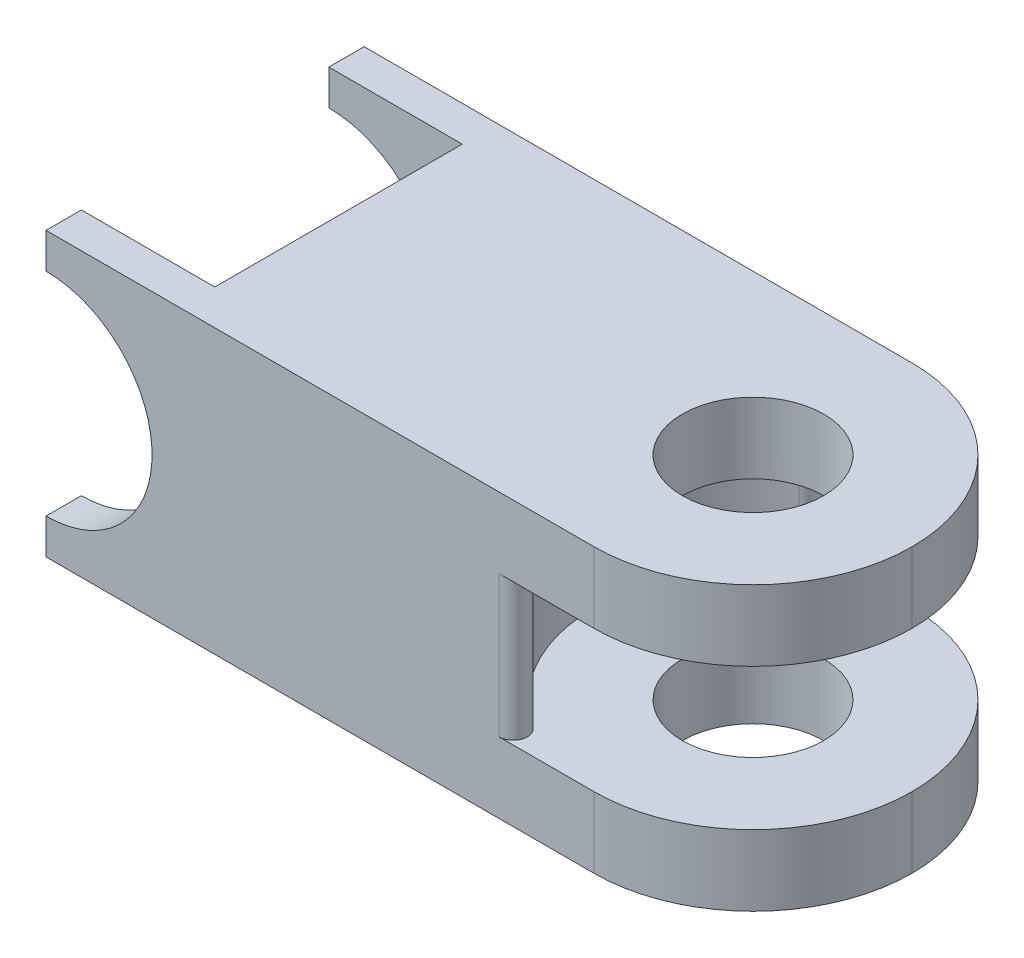
ISO-10303-21;
HEADER;
FILE_DESCRIPTION(('STEP AP214'),'2;1');
FILE_NAME('part.step','',(''),(''),'','','');
FILE_SCHEMA(('AUTOMOTIVE_DESIGN { 1 0 10303 214 1 1 1 1 }'));
ENDSEC;
DATA;
#1=APPLICATION_CONTEXT('core data for automotive mechanical design processes');
#2=APPLICATION_PROTOCOL_DEFINITION('international standard','automotive_design',2000,#1);
#3=PRODUCT_CONTEXT('',#1,'mechanical');
#4=PRODUCT('Part','Part','',(#3));
#5=PRODUCT_RELATED_PRODUCT_CATEGORY('part','',(#4));
#6=PRODUCT_DEFINITION_FORMATION('','',#4);
#7=PRODUCT_DEFINITION_CONTEXT('part definition',#1,'design');
#8=PRODUCT_DEFINITION('design','',#6,#7);
#9=PRODUCT_DEFINITION_SHAPE('','',#8);
#10=(LENGTH_UNIT() NAMED_UNIT(*) SI_UNIT(.MILLI.,.METRE.));
#11=(NAMED_UNIT(*) PLANE_ANGLE_UNIT() SI_UNIT($,.RADIAN.));
#12=(NAMED_UNIT(*) SI_UNIT($,.STERADIAN.) SOLID_ANGLE_UNIT());
#13=UNCERTAINTY_MEASURE_WITH_UNIT(LENGTH_MEASURE(1.E-05),#10,'distance_accuracy_value','');
#14=(GEOMETRIC_REPRESENTATION_CONTEXT(3) GLOBAL_UNCERTAINTY_ASSIGNED_CONTEXT((#13)) GLOBAL_UNIT_ASSIGNED_CONTEXT((#10,
#11,#12)) REPRESENTATION_CONTEXT('',''));
#15=CARTESIAN_POINT('',(0.,0.,0.));
#16=DIRECTION('',(0.,0.,1.));
#17=DIRECTION('',(1.,0.,0.));
#18=AXIS2_PLACEMENT_3D('',#15,#16,#17);
#19=CARTESIAN_POINT('',(27.5,-20.,0.));
#20=DIRECTION('',(0.,-1.,0.));
#21=DIRECTION('',(0.,0.,-1.));
#22=AXIS2_PLACEMENT_3D('',#19,#20,#21);
#23=CYLINDRICAL_SURFACE('',#22,22.5);
#24=DIRECTION('',(0.,1.,0.));
#25=VECTOR('',#24,1.);
#26=CARTESIAN_POINT('',(27.5,-20.,-22.5));
#27=LINE('',#26,#25);
#28=CARTESIAN_POINT('',(27.5,-10.,-22.5));
#29=VERTEX_POINT('',#28);
#30=CARTESIAN_POINT('',(27.5,-20.,-22.5));
#31=VERTEX_POINT('',#30);
#32=EDGE_CURVE('E220',#29,#31,#27,.F.);
#33=ORIENTED_EDGE('',*,*,#32,.F.);
#34=CARTESIAN_POINT('',(27.5,-10.,0.));
#35=DIRECTION('',(0.,1.,0.));
#36=DIRECTION('',(0.,0.,1.));
#37=AXIS2_PLACEMENT_3D('',#34,#35,#36);
#38=CIRCLE('',#37,22.5);
#39=CARTESIAN_POINT('',(50.,-10.,0.));
#40=VERTEX_POINT('',#39);
#41=EDGE_CURVE('E257',#40,#29,#38,.T.);
#42=ORIENTED_EDGE('',*,*,#41,.F.);
#43=DIRECTION('',(0.,1.,0.));
#44=VECTOR('',#43,1.);
#45=CARTESIAN_POINT('',(50.,20.,0.));
#46=LINE('',#45,#44);
#47=CARTESIAN_POINT('',(50.,-20.,0.));
#48=VERTEX_POINT('',#47);
#49=EDGE_CURVE('E223',#48,#40,#46,.T.);
#50=ORIENTED_EDGE('',*,*,#49,.F.);
#51=CARTESIAN_POINT('',(27.5,-20.,0.));
#52=DIRECTION('',(0.,1.,0.));
#53=DIRECTION('',(0.,0.,1.));
#54=AXIS2_PLACEMENT_3D('',#51,#52,#53);
#55=CIRCLE('',#54,22.5);
#56=EDGE_CURVE('E216',#31,#48,#55,.F.);
#57=ORIENTED_EDGE('',*,*,#56,.F.);
#58=EDGE_LOOP('',(#33,#42,#50,#57));
#59=FACE_BOUND('',#58,.T.);
#60=ADVANCED_FACE('F43',(#59),#23,.T.);
#61=CARTESIAN_POINT('',(27.5,0.,0.));
#62=DIRECTION('',(0.,1.,0.));
#63=DIRECTION('',(0.,0.,1.));
#64=AXIS2_PLACEMENT_3D('',#61,#62,#63);
#65=CYLINDRICAL_SURFACE('',#64,22.5);
#66=ORIENTED_EDGE('',*,*,#49,.T.);
#67=CARTESIAN_POINT('',(27.5,-10.,22.5));
#68=VERTEX_POINT('',#67);
#69=EDGE_CURVE('E259',#68,#40,#38,.T.);
#70=ORIENTED_EDGE('',*,*,#69,.F.);
#71=DIRECTION('',(0.,1.,0.));
#72=VECTOR('',#71,1.);
#73=CARTESIAN_POINT('',(27.5,0.,22.5));
#74=LINE('',#73,#72);
#75=CARTESIAN_POINT('',(27.5,-20.,22.5));
#76=VERTEX_POINT('',#75);
#77=EDGE_CURVE('E205',#76,#68,#74,.T.);
#78=ORIENTED_EDGE('',*,*,#77,.F.);
#79=CARTESIAN_POINT('',(27.5,-20.,0.));
#80=DIRECTION('',(0.,1.,0.));
#81=DIRECTION('',(0.,0.,1.));
#82=AXIS2_PLACEMENT_3D('',#79,#80,#81);
#83=CIRCLE('',#82,22.5);
#84=EDGE_CURVE('E218',#48,#76,#83,.F.);
#85=ORIENTED_EDGE('',*,*,#84,.F.);
#86=EDGE_LOOP('',(#66,#70,#78,#85));
#87=FACE_BOUND('',#86,.T.);
#88=ADVANCED_FACE('F388',(#87),#65,.T.);
#89=CARTESIAN_POINT('',(-50.,-20.,22.5));
#90=DIRECTION('',(-1.,0.,0.));
#91=DIRECTION('',(0.,0.,1.));
#92=AXIS2_PLACEMENT_3D('',#89,#90,#91);
#93=PLANE('',#92);
#94=DIRECTION('',(0.,0.,1.));
#95=VECTOR('',#94,1.);
#96=CARTESIAN_POINT('',(-50.,-15.,-50.));
#97=LINE('',#96,#95);
#98=CARTESIAN_POINT('',(-50.,-15.,-22.5));
#99=VERTEX_POINT('',#98);
#100=CARTESIAN_POINT('',(-50.,-15.,-17.5));
#101=VERTEX_POINT('',#100);
#102=EDGE_CURVE('E283',#99,#101,#97,.T.);
#103=ORIENTED_EDGE('',*,*,#102,.F.);
#104=DIRECTION('',(0.,1.,0.));
#105=VECTOR('',#104,1.);
#106=CARTESIAN_POINT('',(-50.,-20.,-22.5));
#107=LINE('',#106,#105);
#108=CARTESIAN_POINT('',(-50.,-20.,-22.5));
#109=VERTEX_POINT('',#108);
#110=EDGE_CURVE('E320',#109,#99,#107,.T.);
#111=ORIENTED_EDGE('',*,*,#110,.F.);
#112=DIRECTION('',(0.,0.,-1.));
#113=VECTOR('',#112,1.);
#114=CARTESIAN_POINT('',(-50.,-20.,22.5));
#115=LINE('',#114,#113);
#116=CARTESIAN_POINT('',(-50.,-20.,-17.5));
#117=VERTEX_POINT('',#116);
#118=EDGE_CURVE('E331',#117,#109,#115,.T.);
#119=ORIENTED_EDGE('',*,*,#118,.F.);
#120=DIRECTION('',(0.,1.,0.));
#121=VECTOR('',#120,1.);
#122=CARTESIAN_POINT('',(-50.,-20.,-17.5));
#123=LINE('',#122,#121);
#124=EDGE_CURVE('E301',#117,#101,#123,.T.);
#125=ORIENTED_EDGE('',*,*,#124,.T.);
#126=EDGE_LOOP('',(#103,#111,#119,#125));
#127=FACE_BOUND('',#126,.T.);
#128=ADVANCED_FACE('F375',(#127),#93,.T.);
#129=DIRECTION('',(0.,0.,1.));
#130=VECTOR('',#129,1.);
#131=CARTESIAN_POINT('',(-50.,-15.,-50.));
#132=LINE('',#131,#130);
#133=CARTESIAN_POINT('',(-50.,-15.,17.5));
#134=VERTEX_POINT('',#133);
#135=CARTESIAN_POINT('',(-50.,-15.,22.5));
#136=VERTEX_POINT('',#135);
#137=EDGE_CURVE('E274',#134,#136,#132,.T.);
#138=ORIENTED_EDGE('',*,*,#137,.F.);
#139=DIRECTION('',(0.,1.,0.));
#140=VECTOR('',#139,1.);
#141=CARTESIAN_POINT('',(-50.,-20.,17.5));
#142=LINE('',#141,#140);
#143=CARTESIAN_POINT('',(-50.,-20.,17.5));
#144=VERTEX_POINT('',#143);
#145=EDGE_CURVE('E294',#144,#134,#142,.T.);
#146=ORIENTED_EDGE('',*,*,#145,.F.);
#147=CARTESIAN_POINT('',(-50.,-20.,22.5));
#148=VERTEX_POINT('',#147);
#149=EDGE_CURVE('E327',#148,#144,#115,.T.);
#150=ORIENTED_EDGE('',*,*,#149,.F.);
#151=DIRECTION('',(0.,1.,0.));
#152=VECTOR('',#151,1.);
#153=CARTESIAN_POINT('',(-50.,-20.,22.5));
#154=LINE('',#153,#152);
#155=EDGE_CURVE('E310',#148,#136,#154,.T.);
#156=ORIENTED_EDGE('',*,*,#155,.T.);
#157=EDGE_LOOP('',(#138,#146,#150,#156));
#158=FACE_BOUND('',#157,.T.);
#159=ADVANCED_FACE('F363',(#158),#93,.T.);
#160=DIRECTION('',(0.,0.,1.));
#161=VECTOR('',#160,1.);
#162=CARTESIAN_POINT('',(-50.,15.,-50.));
#163=LINE('',#162,#161);
#164=CARTESIAN_POINT('',(-50.,15.,-17.5));
#165=VERTEX_POINT('',#164);
#166=CARTESIAN_POINT('',(-50.,15.,-22.5));
#167=VERTEX_POINT('',#166);
#168=EDGE_CURVE('E281',#165,#167,#163,.F.);
#169=ORIENTED_EDGE('',*,*,#168,.F.);
#170=CARTESIAN_POINT('',(-50.,20.,-17.5));
#171=VERTEX_POINT('',#170);
#172=EDGE_CURVE('E300',#165,#171,#123,.T.);
#173=ORIENTED_EDGE('',*,*,#172,.T.);
#174=DIRECTION('',(0.,0.,-1.));
#175=VECTOR('',#174,1.);
#176=CARTESIAN_POINT('',(-50.,20.,22.5));
#177=LINE('',#176,#175);
#178=CARTESIAN_POINT('',(-50.,20.,-22.5));
#179=VERTEX_POINT('',#178);
#180=EDGE_CURVE('E319',#171,#179,#177,.T.);
#181=ORIENTED_EDGE('',*,*,#180,.T.);
#182=EDGE_CURVE('E309',#167,#179,#107,.T.);
#183=ORIENTED_EDGE('',*,*,#182,.F.);
#184=EDGE_LOOP('',(#169,#173,#181,#183));
#185=FACE_BOUND('',#184,.T.);
#186=ADVANCED_FACE('F376',(#185),#93,.T.);
#187=CARTESIAN_POINT('',(-50.,-20.,22.5));
#188=DIRECTION('',(0.,1.,0.));
#189=DIRECTION('',(0.,0.,1.));
#190=AXIS2_PLACEMENT_3D('',#187,#188,#189);
#191=PLANE('',#190);
#192=CARTESIAN_POINT('',(27.5,-20.,0.));
#193=DIRECTION('',(0.,1.,0.));
#194=DIRECTION('',(0.,0.,1.));
#195=AXIS2_PLACEMENT_3D('',#192,#193,#194);
#196=CIRCLE('',#195,10.);
#197=CARTESIAN_POINT('',(27.5,-20.,10.));
#198=VERTEX_POINT('',#197);
#199=EDGE_CURVE('E429',#198,#198,#196,.T.);
#200=ORIENTED_EDGE('',*,*,#199,.T.);
#201=EDGE_LOOP('',(#200));
#202=FACE_BOUND('',#201,.T.);
#203=ORIENTED_EDGE('',*,*,#56,.T.);
#204=ORIENTED_EDGE('',*,*,#84,.T.);
#205=DIRECTION('',(1.,0.,0.));
#206=VECTOR('',#205,1.);
#207=CARTESIAN_POINT('',(-50.,-20.,22.5));
#208=LINE('',#207,#206);
#209=EDGE_CURVE('E316',#148,#76,#208,.T.);
#210=ORIENTED_EDGE('',*,*,#209,.F.);
#211=ORIENTED_EDGE('',*,*,#149,.T.);
#212=DIRECTION('',(1.,0.,0.));
#213=VECTOR('',#212,1.);
#214=CARTESIAN_POINT('',(-50.,-20.,17.5));
#215=LINE('',#214,#213);
#216=CARTESIAN_POINT('',(-31.1254139118231,-20.,17.5));
#217=VERTEX_POINT('',#216);
#218=EDGE_CURVE('E297',#144,#217,#215,.T.);
#219=ORIENTED_EDGE('',*,*,#218,.T.);
#220=DIRECTION('',(0.,0.,1.));
#221=VECTOR('',#220,1.);
#222=CARTESIAN_POINT('',(-31.1254139118231,-20.,-17.5));
#223=LINE('',#222,#221);
#224=CARTESIAN_POINT('',(-31.1254139118231,-20.,-17.5));
#225=VERTEX_POINT('',#224);
#226=EDGE_CURVE('E306',#217,#225,#223,.F.);
#227=ORIENTED_EDGE('',*,*,#226,.T.);
#228=DIRECTION('',(1.,0.,0.));
#229=VECTOR('',#228,1.);
#230=CARTESIAN_POINT('',(-50.,-20.,-17.5));
#231=LINE('',#230,#229);
#232=EDGE_CURVE('E304',#117,#225,#231,.T.);
#233=ORIENTED_EDGE('',*,*,#232,.F.);
#234=ORIENTED_EDGE('',*,*,#118,.T.);
#235=DIRECTION('',(1.,0.,0.));
#236=VECTOR('',#235,1.);
#237=CARTESIAN_POINT('',(-50.,-20.,-22.5));
#238=LINE('',#237,#236);
#239=EDGE_CURVE('E324',#109,#31,#238,.T.);
#240=ORIENTED_EDGE('',*,*,#239,.T.);
#241=EDGE_LOOP('',(#203,#204,#210,#211,#219,#227,#233,#234,#240));
#242=FACE_BOUND('',#241,.T.);
#243=ADVANCED_FACE('F355',(#202,#242),#191,.F.);
#244=CARTESIAN_POINT('',(-50.,20.,22.5));
#245=DIRECTION('',(0.,1.,0.));
#246=DIRECTION('',(0.,0.,1.));
#247=AXIS2_PLACEMENT_3D('',#244,#245,#246);
#248=PLANE('',#247);
#249=CARTESIAN_POINT('',(27.5,20.,0.));
#250=DIRECTION('',(0.,-1.,0.));
#251=DIRECTION('',(0.,0.,-1.));
#252=AXIS2_PLACEMENT_3D('',#249,#250,#251);
#253=CIRCLE('',#252,10.);
#254=CARTESIAN_POINT('',(27.5,20.,-10.));
#255=VERTEX_POINT('',#254);
#256=EDGE_CURVE('E431',#255,#255,#253,.T.);
#257=ORIENTED_EDGE('',*,*,#256,.T.);
#258=EDGE_LOOP('',(#257));
#259=FACE_BOUND('',#258,.T.);
#260=DIRECTION('',(1.,0.,0.));
#261=VECTOR('',#260,1.);
#262=CARTESIAN_POINT('',(-50.,20.,22.5));
#263=LINE('',#262,#261);
#264=CARTESIAN_POINT('',(-50.,20.,22.5));
#265=VERTEX_POINT('',#264);
#266=CARTESIAN_POINT('',(27.5,20.,22.5));
#267=VERTEX_POINT('',#266);
#268=EDGE_CURVE('E313',#265,#267,#263,.T.);
#269=ORIENTED_EDGE('',*,*,#268,.T.);
#270=CARTESIAN_POINT('',(27.5,20.,0.));
#271=DIRECTION('',(0.,1.,0.));
#272=DIRECTION('',(0.,0.,1.));
#273=AXIS2_PLACEMENT_3D('',#270,#271,#272);
#274=CIRCLE('',#273,22.5);
#275=CARTESIAN_POINT('',(50.,20.,0.));
#276=VERTEX_POINT('',#275);
#277=EDGE_CURVE('E203',#267,#276,#274,.T.);
#278=ORIENTED_EDGE('',*,*,#277,.T.);
#279=CARTESIAN_POINT('',(27.5,20.,0.));
#280=DIRECTION('',(0.,1.,0.));
#281=DIRECTION('',(0.,0.,1.));
#282=AXIS2_PLACEMENT_3D('',#279,#280,#281);
#283=CIRCLE('',#282,22.5);
#284=CARTESIAN_POINT('',(27.5,20.,-22.5));
#285=VERTEX_POINT('',#284);
#286=EDGE_CURVE('E208',#276,#285,#283,.T.);
#287=ORIENTED_EDGE('',*,*,#286,.T.);
#288=DIRECTION('',(1.,0.,0.));
#289=VECTOR('',#288,1.);
#290=CARTESIAN_POINT('',(-50.,20.,-22.5));
#291=LINE('',#290,#289);
#292=EDGE_CURVE('E266',#179,#285,#291,.T.);
#293=ORIENTED_EDGE('',*,*,#292,.F.);
#294=ORIENTED_EDGE('',*,*,#180,.F.);
#295=DIRECTION('',(1.,0.,0.));
#296=VECTOR('',#295,1.);
#297=CARTESIAN_POINT('',(-50.,20.,-17.5));
#298=LINE('',#297,#296);
#299=CARTESIAN_POINT('',(-31.1254139118231,20.,-17.5));
#300=VERTEX_POINT('',#299);
#301=EDGE_CURVE('E210',#171,#300,#298,.T.);
#302=ORIENTED_EDGE('',*,*,#301,.T.);
#303=DIRECTION('',(0.,0.,1.));
#304=VECTOR('',#303,1.);
#305=CARTESIAN_POINT('',(-31.1254139118231,20.,-17.5));
#306=LINE('',#305,#304);
#307=CARTESIAN_POINT('',(-31.1254139118231,20.,17.5));
#308=VERTEX_POINT('',#307);
#309=EDGE_CURVE('E336',#308,#300,#306,.F.);
#310=ORIENTED_EDGE('',*,*,#309,.F.);
#311=DIRECTION('',(1.,0.,0.));
#312=VECTOR('',#311,1.);
#313=CARTESIAN_POINT('',(-50.,20.,17.5));
#314=LINE('',#313,#312);
#315=CARTESIAN_POINT('',(-50.,20.,17.5));
#316=VERTEX_POINT('',#315);
#317=EDGE_CURVE('E330',#316,#308,#314,.T.);
#318=ORIENTED_EDGE('',*,*,#317,.F.);
#319=EDGE_CURVE('E332',#265,#316,#177,.T.);
#320=ORIENTED_EDGE('',*,*,#319,.F.);
#321=EDGE_LOOP('',(#269,#278,#287,#293,#294,#302,#310,#318,#320));
#322=FACE_BOUND('',#321,.T.);
#323=ADVANCED_FACE('F342',(#259,#322),#248,.T.);
#324=DIRECTION('',(0.,0.,1.));
#325=VECTOR('',#324,1.);
#326=CARTESIAN_POINT('',(-50.,15.,-50.));
#327=LINE('',#326,#325);
#328=CARTESIAN_POINT('',(-50.,15.,22.5));
#329=VERTEX_POINT('',#328);
#330=CARTESIAN_POINT('',(-50.,15.,17.5));
#331=VERTEX_POINT('',#330);
#332=EDGE_CURVE('E226',#329,#331,#327,.F.);
#333=ORIENTED_EDGE('',*,*,#332,.F.);
#334=EDGE_CURVE('E314',#329,#265,#154,.T.);
#335=ORIENTED_EDGE('',*,*,#334,.T.);
#336=ORIENTED_EDGE('',*,*,#319,.T.);
#337=EDGE_CURVE('E291',#331,#316,#142,.T.);
#338=ORIENTED_EDGE('',*,*,#337,.F.);
#339=EDGE_LOOP('',(#333,#335,#336,#338));
#340=FACE_BOUND('',#339,.T.);
#341=ADVANCED_FACE('F371',(#340),#93,.T.);
#342=CARTESIAN_POINT('',(0.,0.,22.5));
#343=DIRECTION('',(0.,0.,-1.));
#344=DIRECTION('',(-1.,0.,0.));
#345=AXIS2_PLACEMENT_3D('',#342,#343,#344);
#346=PLANE('',#345);
#347=DIRECTION('',(0.,1.,0.));
#348=VECTOR('',#347,1.);
#349=CARTESIAN_POINT('',(14.0835921350013,0.,22.5));
#350=LINE('',#349,#348);
#351=CARTESIAN_POINT('',(14.0835921350013,-10.,22.5));
#352=VERTEX_POINT('',#351);
#353=CARTESIAN_POINT('',(14.0835921350013,10.,22.5));
#354=VERTEX_POINT('',#353);
#355=EDGE_CURVE('E188',#352,#354,#350,.T.);
#356=ORIENTED_EDGE('',*,*,#355,.T.);
#357=DIRECTION('',(1.,0.,0.));
#358=VECTOR('',#357,1.);
#359=CARTESIAN_POINT('',(0.,10.,22.5));
#360=LINE('',#359,#358);
#361=CARTESIAN_POINT('',(27.5,10.,22.5));
#362=VERTEX_POINT('',#361);
#363=EDGE_CURVE('E180',#354,#362,#360,.T.);
#364=ORIENTED_EDGE('',*,*,#363,.T.);
#365=EDGE_CURVE('E185',#362,#267,#74,.T.);
#366=ORIENTED_EDGE('',*,*,#365,.T.);
#367=ORIENTED_EDGE('',*,*,#268,.F.);
#368=ORIENTED_EDGE('',*,*,#334,.F.);
#369=CARTESIAN_POINT('',(-50.,0.,22.5));
#370=DIRECTION('',(0.,0.,-1.));
#371=DIRECTION('',(-1.,0.,0.));
#372=AXIS2_PLACEMENT_3D('',#369,#370,#371);
#373=CIRCLE('',#372,15.);
#374=EDGE_CURVE('E276',#329,#136,#373,.T.);
#375=ORIENTED_EDGE('',*,*,#374,.T.);
#376=ORIENTED_EDGE('',*,*,#155,.F.);
#377=ORIENTED_EDGE('',*,*,#209,.T.);
#378=ORIENTED_EDGE('',*,*,#77,.T.);
#379=DIRECTION('',(-1.,0.,0.));
#380=VECTOR('',#379,1.);
#381=CARTESIAN_POINT('',(27.5,-10.,22.5));
#382=LINE('',#381,#380);
#383=EDGE_CURVE('E66',#68,#352,#382,.T.);
#384=ORIENTED_EDGE('',*,*,#383,.T.);
#385=EDGE_LOOP('',(#356,#364,#366,#367,#368,#375,#376,#377,#378,#384));
#386=FACE_BOUND('',#385,.T.);
#387=ADVANCED_FACE('F182',(#386),#346,.F.);
#388=CARTESIAN_POINT('',(0.,0.,-22.5));
#389=DIRECTION('',(0.,0.,-1.));
#390=DIRECTION('',(-1.,0.,0.));
#391=AXIS2_PLACEMENT_3D('',#388,#389,#390);
#392=PLANE('',#391);
#393=DIRECTION('',(0.,-1.,0.));
#394=VECTOR('',#393,1.);
#395=CARTESIAN_POINT('',(14.0835921350013,-10.,-22.5));
#396=LINE('',#395,#394);
#397=CARTESIAN_POINT('',(14.0835921350013,10.,-22.5));
#398=VERTEX_POINT('',#397);
#399=CARTESIAN_POINT('',(14.0835921350013,-10.,-22.5));
#400=VERTEX_POINT('',#399);
#401=EDGE_CURVE('E234',#398,#400,#396,.T.);
#402=ORIENTED_EDGE('',*,*,#401,.T.);
#403=DIRECTION('',(1.,0.,0.));
#404=VECTOR('',#403,1.);
#405=CARTESIAN_POINT('',(0.,-10.,-22.5));
#406=LINE('',#405,#404);
#407=EDGE_CURVE('E237',#400,#29,#406,.T.);
#408=ORIENTED_EDGE('',*,*,#407,.T.);
#409=ORIENTED_EDGE('',*,*,#32,.T.);
#410=ORIENTED_EDGE('',*,*,#239,.F.);
#411=ORIENTED_EDGE('',*,*,#110,.T.);
#412=CARTESIAN_POINT('',(-50.,0.,-22.5));
#413=DIRECTION('',(0.,0.,-1.));
#414=DIRECTION('',(-1.,0.,0.));
#415=AXIS2_PLACEMENT_3D('',#412,#413,#414);
#416=CIRCLE('',#415,15.);
#417=EDGE_CURVE('E285',#167,#99,#416,.T.);
#418=ORIENTED_EDGE('',*,*,#417,.F.);
#419=ORIENTED_EDGE('',*,*,#182,.T.);
#420=ORIENTED_EDGE('',*,*,#292,.T.);
#421=CARTESIAN_POINT('',(27.5,10.,-22.5));
#422=VERTEX_POINT('',#421);
#423=EDGE_CURVE('E221',#285,#422,#27,.F.);
#424=ORIENTED_EDGE('',*,*,#423,.T.);
#425=DIRECTION('',(-1.,0.,0.));
#426=VECTOR('',#425,1.);
#427=CARTESIAN_POINT('',(27.5,10.,-22.5));
#428=LINE('',#427,#426);
#429=EDGE_CURVE('E58',#422,#398,#428,.T.);
#430=ORIENTED_EDGE('',*,*,#429,.T.);
#431=EDGE_LOOP('',(#402,#408,#409,#410,#411,#418,#419,#420,#424,#430));
#432=FACE_BOUND('',#431,.T.);
#433=ADVANCED_FACE('F262',(#432),#392,.T.);
#434=CARTESIAN_POINT('',(-50.,0.,-17.5));
#435=DIRECTION('',(0.,0.,1.));
#436=DIRECTION('',(1.,0.,0.));
#437=AXIS2_PLACEMENT_3D('',#434,#435,#436);
#438=CYLINDRICAL_SURFACE('',#437,27.5);
#439=CARTESIAN_POINT('',(-50.,0.,17.5));
#440=DIRECTION('',(0.,0.,1.));
#441=DIRECTION('',(1.,0.,0.));
#442=AXIS2_PLACEMENT_3D('',#439,#440,#441);
#443=CIRCLE('',#442,27.5);
#444=EDGE_CURVE('E287',#217,#308,#443,.T.);
#445=ORIENTED_EDGE('',*,*,#444,.T.);
#446=ORIENTED_EDGE('',*,*,#309,.T.);
#447=CARTESIAN_POINT('',(-50.,0.,-17.5));
#448=DIRECTION('',(0.,0.,1.));
#449=DIRECTION('',(1.,0.,0.));
#450=AXIS2_PLACEMENT_3D('',#447,#448,#449);
#451=CIRCLE('',#450,27.5);
#452=EDGE_CURVE('E288',#225,#300,#451,.T.);
#453=ORIENTED_EDGE('',*,*,#452,.F.);
#454=ORIENTED_EDGE('',*,*,#226,.F.);
#455=EDGE_LOOP('',(#445,#446,#453,#454));
#456=FACE_BOUND('',#455,.T.);
#457=ADVANCED_FACE('F352',(#456),#438,.F.);
#458=CARTESIAN_POINT('',(-50.,0.,-17.5));
#459=DIRECTION('',(0.,0.,1.));
#460=DIRECTION('',(1.,0.,0.));
#461=AXIS2_PLACEMENT_3D('',#458,#459,#460);
#462=PLANE('',#461);
#463=CARTESIAN_POINT('',(-50.,0.,-17.5));
#464=DIRECTION('',(0.,0.,1.));
#465=DIRECTION('',(1.,0.,0.));
#466=AXIS2_PLACEMENT_3D('',#463,#464,#465);
#467=CIRCLE('',#466,15.);
#468=EDGE_CURVE('E279',#101,#165,#467,.T.);
#469=ORIENTED_EDGE('',*,*,#468,.F.);
#470=ORIENTED_EDGE('',*,*,#124,.F.);
#471=ORIENTED_EDGE('',*,*,#232,.T.);
#472=ORIENTED_EDGE('',*,*,#452,.T.);
#473=ORIENTED_EDGE('',*,*,#301,.F.);
#474=ORIENTED_EDGE('',*,*,#172,.F.);
#475=EDGE_LOOP('',(#469,#470,#471,#472,#473,#474));
#476=FACE_BOUND('',#475,.T.);
#477=ADVANCED_FACE('F348',(#476),#462,.T.);
#478=CARTESIAN_POINT('',(-50.,0.,17.5));
#479=DIRECTION('',(0.,0.,1.));
#480=DIRECTION('',(1.,0.,0.));
#481=AXIS2_PLACEMENT_3D('',#478,#479,#480);
#482=PLANE('',#481);
#483=ORIENTED_EDGE('',*,*,#145,.T.);
#484=CARTESIAN_POINT('',(-50.,0.,17.5));
#485=DIRECTION('',(0.,0.,1.));
#486=DIRECTION('',(1.,0.,0.));
#487=AXIS2_PLACEMENT_3D('',#484,#485,#486);
#488=CIRCLE('',#487,15.);
#489=EDGE_CURVE('E206',#134,#331,#488,.T.);
#490=ORIENTED_EDGE('',*,*,#489,.T.);
#491=ORIENTED_EDGE('',*,*,#337,.T.);
#492=ORIENTED_EDGE('',*,*,#317,.T.);
#493=ORIENTED_EDGE('',*,*,#444,.F.);
#494=ORIENTED_EDGE('',*,*,#218,.F.);
#495=EDGE_LOOP('',(#483,#490,#491,#492,#493,#494));
#496=FACE_BOUND('',#495,.T.);
#497=ADVANCED_FACE('F360',(#496),#482,.F.);
#498=CARTESIAN_POINT('',(-50.,0.,-50.));
#499=DIRECTION('',(0.,0.,1.));
#500=DIRECTION('',(1.,0.,0.));
#501=AXIS2_PLACEMENT_3D('',#498,#499,#500);
#502=CYLINDRICAL_SURFACE('',#501,15.);
#503=ORIENTED_EDGE('',*,*,#332,.T.);
#504=ORIENTED_EDGE('',*,*,#489,.F.);
#505=ORIENTED_EDGE('',*,*,#137,.T.);
#506=ORIENTED_EDGE('',*,*,#374,.F.);
#507=EDGE_LOOP('',(#503,#504,#505,#506));
#508=FACE_BOUND('',#507,.T.);
#509=ADVANCED_FACE('F366',(#508),#502,.F.);
#510=ORIENTED_EDGE('',*,*,#417,.T.);
#511=ORIENTED_EDGE('',*,*,#102,.T.);
#512=ORIENTED_EDGE('',*,*,#468,.T.);
#513=ORIENTED_EDGE('',*,*,#168,.T.);
#514=EDGE_LOOP('',(#510,#511,#512,#513));
#515=FACE_BOUND('',#514,.T.);
#516=ADVANCED_FACE('F402',(#515),#502,.F.);
#517=CARTESIAN_POINT('',(27.5,10.,0.));
#518=DIRECTION('',(0.,1.,0.));
#519=DIRECTION('',(0.,0.,1.));
#520=AXIS2_PLACEMENT_3D('',#517,#518,#519);
#521=CIRCLE('',#520,22.5);
#522=CARTESIAN_POINT('',(50.,10.,0.));
#523=VERTEX_POINT('',#522);
#524=EDGE_CURVE('E195',#523,#422,#521,.T.);
#525=ORIENTED_EDGE('',*,*,#524,.T.);
#526=ORIENTED_EDGE('',*,*,#423,.F.);
#527=ORIENTED_EDGE('',*,*,#286,.F.);
#528=EDGE_CURVE('E227',#523,#276,#46,.T.);
#529=ORIENTED_EDGE('',*,*,#528,.F.);
#530=EDGE_LOOP('',(#525,#526,#527,#529));
#531=FACE_BOUND('',#530,.T.);
#532=ADVANCED_FACE('F269',(#531),#23,.T.);
#533=EDGE_CURVE('E192',#362,#523,#521,.T.);
#534=ORIENTED_EDGE('',*,*,#533,.T.);
#535=ORIENTED_EDGE('',*,*,#528,.T.);
#536=ORIENTED_EDGE('',*,*,#277,.F.);
#537=ORIENTED_EDGE('',*,*,#365,.F.);
#538=EDGE_LOOP('',(#534,#535,#536,#537));
#539=FACE_BOUND('',#538,.T.);
#540=ADVANCED_FACE('F201',(#539),#65,.T.);
#541=CARTESIAN_POINT('',(27.5,-10.,0.));
#542=DIRECTION('',(0.,1.,0.));
#543=DIRECTION('',(0.,0.,1.));
#544=AXIS2_PLACEMENT_3D('',#541,#542,#543);
#545=CYLINDRICAL_SURFACE('',#544,22.5);
#546=CARTESIAN_POINT('',(15.1788091035726,10.,-18.8265306122449));
#547=VERTEX_POINT('',#546);
#548=CARTESIAN_POINT('',(15.1788091035726,10.,18.8265306122449));
#549=VERTEX_POINT('',#548);
#550=EDGE_CURVE('E200',#547,#549,#521,.T.);
#551=ORIENTED_EDGE('',*,*,#550,.T.);
#552=DIRECTION('',(0.,1.,0.));
#553=VECTOR('',#552,1.);
#554=CARTESIAN_POINT('',(15.1788091035726,-10.,18.8265306122449));
#555=LINE('',#554,#553);
#556=CARTESIAN_POINT('',(15.1788091035726,-10.,18.8265306122449));
#557=VERTEX_POINT('',#556);
#558=EDGE_CURVE('E231',#549,#557,#555,.F.);
#559=ORIENTED_EDGE('',*,*,#558,.T.);
#560=CARTESIAN_POINT('',(15.1788091035726,-10.,-18.8265306122449));
#561=VERTEX_POINT('',#560);
#562=EDGE_CURVE('E198',#561,#557,#38,.T.);
#563=ORIENTED_EDGE('',*,*,#562,.F.);
#564=DIRECTION('',(0.,1.,0.));
#565=VECTOR('',#564,1.);
#566=CARTESIAN_POINT('',(15.1788091035726,-10.,-18.8265306122449));
#567=LINE('',#566,#565);
#568=EDGE_CURVE('E189',#561,#547,#567,.T.);
#569=ORIENTED_EDGE('',*,*,#568,.T.);
#570=EDGE_LOOP('',(#551,#559,#563,#569));
#571=FACE_BOUND('',#570,.T.);
#572=ADVANCED_FACE('F254',(#571),#545,.F.);
#573=CARTESIAN_POINT('',(27.5,-10.,0.));
#574=DIRECTION('',(0.,1.,0.));
#575=DIRECTION('',(0.,0.,1.));
#576=AXIS2_PLACEMENT_3D('',#573,#574,#575);
#577=PLANE('',#576);
#578=CARTESIAN_POINT('',(27.5,-10.,0.));
#579=DIRECTION('',(0.,1.,0.));
#580=DIRECTION('',(0.,0.,1.));
#581=AXIS2_PLACEMENT_3D('',#578,#579,#580);
#582=CIRCLE('',#581,10.);
#583=CARTESIAN_POINT('',(27.5,-10.,10.));
#584=VERTEX_POINT('',#583);
#585=EDGE_CURVE('E270',#584,#584,#582,.F.);
#586=ORIENTED_EDGE('',*,*,#585,.T.);
#587=EDGE_LOOP('',(#586));
#588=FACE_BOUND('',#587,.T.);
#589=ORIENTED_EDGE('',*,*,#69,.T.);
#590=ORIENTED_EDGE('',*,*,#41,.T.);
#591=ORIENTED_EDGE('',*,*,#407,.F.);
#592=CARTESIAN_POINT('',(14.0835921350013,-10.,-20.5));
#593=DIRECTION('',(0.,1.,0.));
#594=DIRECTION('',(0.,0.,1.));
#595=AXIS2_PLACEMENT_3D('',#592,#593,#594);
#596=CIRCLE('',#595,2.);
#597=EDGE_CURVE('E52',#400,#561,#596,.F.);
#598=ORIENTED_EDGE('',*,*,#597,.T.);
#599=ORIENTED_EDGE('',*,*,#562,.T.);
#600=CARTESIAN_POINT('',(14.0835921350013,-10.,20.5));
#601=DIRECTION('',(0.,1.,0.));
#602=DIRECTION('',(0.,0.,1.));
#603=AXIS2_PLACEMENT_3D('',#600,#601,#602);
#604=CIRCLE('',#603,2.);
#605=EDGE_CURVE('E241',#557,#352,#604,.F.);
#606=ORIENTED_EDGE('',*,*,#605,.T.);
#607=ORIENTED_EDGE('',*,*,#383,.F.);
#608=EDGE_LOOP('',(#589,#590,#591,#598,#599,#606,#607));
#609=FACE_BOUND('',#608,.T.);
#610=ADVANCED_FACE('F246',(#588,#609),#577,.T.);
#611=CARTESIAN_POINT('',(27.5,10.,0.));
#612=DIRECTION('',(0.,1.,0.));
#613=DIRECTION('',(0.,0.,1.));
#614=AXIS2_PLACEMENT_3D('',#611,#612,#613);
#615=PLANE('',#614);
#616=CARTESIAN_POINT('',(27.5,10.,0.));
#617=DIRECTION('',(0.,1.,0.));
#618=DIRECTION('',(0.,0.,1.));
#619=AXIS2_PLACEMENT_3D('',#616,#617,#618);
#620=CIRCLE('',#619,10.);
#621=CARTESIAN_POINT('',(27.5,10.,10.));
#622=VERTEX_POINT('',#621);
#623=EDGE_CURVE('E47',#622,#622,#620,.F.);
#624=ORIENTED_EDGE('',*,*,#623,.F.);
#625=EDGE_LOOP('',(#624));
#626=FACE_BOUND('',#625,.T.);
#627=ORIENTED_EDGE('',*,*,#533,.F.);
#628=ORIENTED_EDGE('',*,*,#363,.F.);
#629=CARTESIAN_POINT('',(14.0835921350013,10.,20.5));
#630=DIRECTION('',(0.,1.,0.));
#631=DIRECTION('',(0.,0.,1.));
#632=AXIS2_PLACEMENT_3D('',#629,#630,#631);
#633=CIRCLE('',#632,2.);
#634=EDGE_CURVE('E239',#354,#549,#633,.T.);
#635=ORIENTED_EDGE('',*,*,#634,.T.);
#636=ORIENTED_EDGE('',*,*,#550,.F.);
#637=CARTESIAN_POINT('',(14.0835921350013,10.,-20.5));
#638=DIRECTION('',(0.,1.,0.));
#639=DIRECTION('',(0.,0.,1.));
#640=AXIS2_PLACEMENT_3D('',#637,#638,#639);
#641=CIRCLE('',#640,2.);
#642=EDGE_CURVE('E11',#547,#398,#641,.T.);
#643=ORIENTED_EDGE('',*,*,#642,.T.);
#644=ORIENTED_EDGE('',*,*,#429,.F.);
#645=ORIENTED_EDGE('',*,*,#524,.F.);
#646=EDGE_LOOP('',(#627,#628,#635,#636,#643,#644,#645));
#647=FACE_BOUND('',#646,.T.);
#648=ADVANCED_FACE('F193',(#626,#647),#615,.F.);
#649=CARTESIAN_POINT('',(14.0835921350013,-10.,20.5));
#650=DIRECTION('',(0.,1.,0.));
#651=DIRECTION('',(0.,0.,1.));
#652=AXIS2_PLACEMENT_3D('',#649,#650,#651);
#653=CYLINDRICAL_SURFACE('',#652,2.);
#654=ORIENTED_EDGE('',*,*,#605,.F.);
#655=ORIENTED_EDGE('',*,*,#558,.F.);
#656=ORIENTED_EDGE('',*,*,#634,.F.);
#657=ORIENTED_EDGE('',*,*,#355,.F.);
#658=EDGE_LOOP('',(#654,#655,#656,#657));
#659=FACE_BOUND('',#658,.T.);
#660=ADVANCED_FACE('F451',(#659),#653,.T.);
#661=CARTESIAN_POINT('',(14.0835921350013,-10.,-20.5));
#662=DIRECTION('',(0.,1.,0.));
#663=DIRECTION('',(0.,0.,1.));
#664=AXIS2_PLACEMENT_3D('',#661,#662,#663);
#665=CYLINDRICAL_SURFACE('',#664,2.);
#666=ORIENTED_EDGE('',*,*,#642,.F.);
#667=ORIENTED_EDGE('',*,*,#568,.F.);
#668=ORIENTED_EDGE('',*,*,#597,.F.);
#669=ORIENTED_EDGE('',*,*,#401,.F.);
#670=EDGE_LOOP('',(#666,#667,#668,#669));
#671=FACE_BOUND('',#670,.T.);
#672=ADVANCED_FACE('F45',(#671),#665,.T.);
#673=CARTESIAN_POINT('',(27.5,-48.2842712474619,0.));
#674=DIRECTION('',(0.,1.,0.));
#675=DIRECTION('',(0.,0.,1.));
#676=AXIS2_PLACEMENT_3D('',#673,#674,#675);
#677=CYLINDRICAL_SURFACE('',#676,10.);
#678=ORIENTED_EDGE('',*,*,#256,.F.);
#679=EDGE_LOOP('',(#678));
#680=FACE_BOUND('',#679,.T.);
#681=ORIENTED_EDGE('',*,*,#623,.T.);
#682=EDGE_LOOP('',(#681));
#683=FACE_BOUND('',#682,.T.);
#684=ADVANCED_FACE('F442',(#680,#683),#677,.F.);
#685=ORIENTED_EDGE('',*,*,#585,.F.);
#686=EDGE_LOOP('',(#685));
#687=FACE_BOUND('',#686,.T.);
#688=ORIENTED_EDGE('',*,*,#199,.F.);
#689=EDGE_LOOP('',(#688));
#690=FACE_BOUND('',#689,.T.);
#691=ADVANCED_FACE('F440',(#687,#690),#677,.F.);
#692=CLOSED_SHELL('',(#60,#88,#128,#159,#186,#243,#323,#341,#387,#433,#457,#477,#497,#509,#516,
#532,#540,#572,#610,#648,#660,#672,#684,#691));
#693=MANIFOLD_SOLID_BREP('B2',#692);
#694=ADVANCED_BREP_SHAPE_REPRESENTATION('',(#18,#693),#14);
#695=SHAPE_DEFINITION_REPRESENTATION(#9,#694);
ENDSEC;
END-ISO-10303-21;
